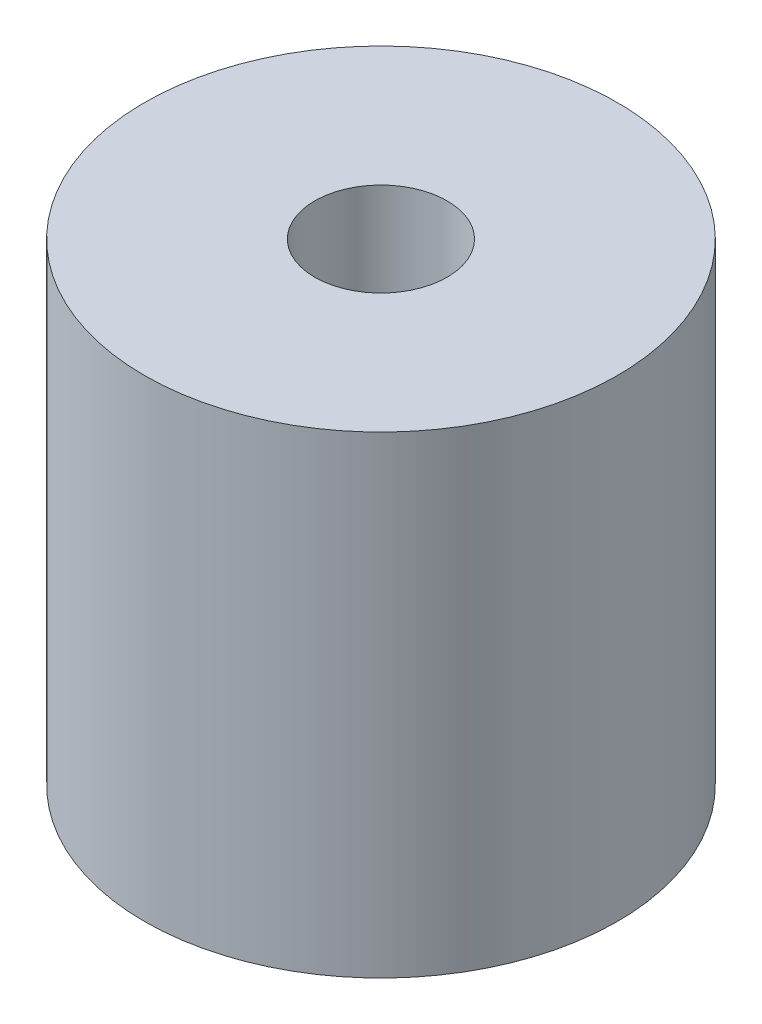
ISO-10303-21;
HEADER;
FILE_DESCRIPTION(('STEP AP214'),'2;1');
FILE_NAME('part.step','',(''),(''),'','','');
FILE_SCHEMA(('AUTOMOTIVE_DESIGN { 1 0 10303 214 1 1 1 1 }'));
ENDSEC;
DATA;
#1=APPLICATION_CONTEXT('core data for automotive mechanical design processes');
#2=APPLICATION_PROTOCOL_DEFINITION('international standard','automotive_design',2000,#1);
#3=PRODUCT_CONTEXT('',#1,'mechanical');
#4=PRODUCT('Part','Part','',(#3));
#5=PRODUCT_RELATED_PRODUCT_CATEGORY('part','',(#4));
#6=PRODUCT_DEFINITION_FORMATION('','',#4);
#7=PRODUCT_DEFINITION_CONTEXT('part definition',#1,'design');
#8=PRODUCT_DEFINITION('design','',#6,#7);
#9=PRODUCT_DEFINITION_SHAPE('','',#8);
#10=(LENGTH_UNIT() NAMED_UNIT(*) SI_UNIT(.MILLI.,.METRE.));
#11=(NAMED_UNIT(*) PLANE_ANGLE_UNIT() SI_UNIT($,.RADIAN.));
#12=(NAMED_UNIT(*) SI_UNIT($,.STERADIAN.) SOLID_ANGLE_UNIT());
#13=UNCERTAINTY_MEASURE_WITH_UNIT(LENGTH_MEASURE(1.E-05),#10,'distance_accuracy_value','');
#14=(GEOMETRIC_REPRESENTATION_CONTEXT(3) GLOBAL_UNCERTAINTY_ASSIGNED_CONTEXT((#13)) GLOBAL_UNIT_ASSIGNED_CONTEXT((#10,
#11,#12)) REPRESENTATION_CONTEXT('',''));
#15=CARTESIAN_POINT('',(0.,0.,0.));
#16=DIRECTION('',(0.,0.,1.));
#17=DIRECTION('',(1.,0.,0.));
#18=AXIS2_PLACEMENT_3D('',#15,#16,#17);
#19=CARTESIAN_POINT('',(0.,6.35,0.));
#20=DIRECTION('',(0.,1.,0.));
#21=DIRECTION('',(0.,0.,1.));
#22=AXIS2_PLACEMENT_3D('',#19,#20,#21);
#23=PLANE('',#22);
#24=CARTESIAN_POINT('',(0.,6.35,0.));
#25=DIRECTION('',(0.,1.,0.));
#26=DIRECTION('',(0.,0.,1.));
#27=AXIS2_PLACEMENT_3D('',#24,#25,#26);
#28=CIRCLE('',#27,3.175);
#29=CARTESIAN_POINT('',(0.,6.35,3.175));
#30=VERTEX_POINT('',#29);
#31=EDGE_CURVE('E10',#30,#30,#28,.T.);
#32=ORIENTED_EDGE('',*,*,#31,.T.);
#33=EDGE_LOOP('',(#32));
#34=FACE_BOUND('',#33,.T.);
#35=CARTESIAN_POINT('',(0.,6.35,0.));
#36=DIRECTION('',(0.,1.,0.));
#37=DIRECTION('',(0.,0.,1.));
#38=AXIS2_PLACEMENT_3D('',#35,#36,#37);
#39=CIRCLE('',#38,0.889);
#40=CARTESIAN_POINT('',(0.,6.35,0.889));
#41=VERTEX_POINT('',#40);
#42=EDGE_CURVE('E42',#41,#41,#39,.T.);
#43=ORIENTED_EDGE('',*,*,#42,.F.);
#44=EDGE_LOOP('',(#43));
#45=FACE_BOUND('',#44,.T.);
#46=ADVANCED_FACE('F31',(#34,#45),#23,.T.);
#47=CARTESIAN_POINT('',(0.,0.,0.));
#48=DIRECTION('',(0.,1.,0.));
#49=DIRECTION('',(0.,0.,1.));
#50=AXIS2_PLACEMENT_3D('',#47,#48,#49);
#51=PLANE('',#50);
#52=CARTESIAN_POINT('',(0.,0.,0.));
#53=DIRECTION('',(0.,1.,0.));
#54=DIRECTION('',(0.,0.,1.));
#55=AXIS2_PLACEMENT_3D('',#52,#53,#54);
#56=CIRCLE('',#55,3.175);
#57=CARTESIAN_POINT('',(0.,0.,3.175));
#58=VERTEX_POINT('',#57);
#59=EDGE_CURVE('E35',#58,#58,#56,.T.);
#60=ORIENTED_EDGE('',*,*,#59,.F.);
#61=EDGE_LOOP('',(#60));
#62=FACE_BOUND('',#61,.T.);
#63=CARTESIAN_POINT('',(0.,0.,0.));
#64=DIRECTION('',(0.,1.,0.));
#65=DIRECTION('',(0.,0.,1.));
#66=AXIS2_PLACEMENT_3D('',#63,#64,#65);
#67=CIRCLE('',#66,0.889);
#68=CARTESIAN_POINT('',(0.,0.,0.889));
#69=VERTEX_POINT('',#68);
#70=EDGE_CURVE('E44',#69,#69,#67,.T.);
#71=ORIENTED_EDGE('',*,*,#70,.T.);
#72=EDGE_LOOP('',(#71));
#73=FACE_BOUND('',#72,.T.);
#74=ADVANCED_FACE('F54',(#62,#73),#51,.F.);
#75=CARTESIAN_POINT('',(0.,6.35,0.));
#76=DIRECTION('',(0.,-1.,0.));
#77=DIRECTION('',(0.,0.,-1.));
#78=AXIS2_PLACEMENT_3D('',#75,#76,#77);
#79=CYLINDRICAL_SURFACE('',#78,3.175);
#80=ORIENTED_EDGE('',*,*,#31,.F.);
#81=EDGE_LOOP('',(#80));
#82=FACE_BOUND('',#81,.T.);
#83=ORIENTED_EDGE('',*,*,#59,.T.);
#84=EDGE_LOOP('',(#83));
#85=FACE_BOUND('',#84,.T.);
#86=ADVANCED_FACE('F33',(#82,#85),#79,.T.);
#87=CARTESIAN_POINT('',(0.,6.35,0.));
#88=DIRECTION('',(0.,-1.,0.));
#89=DIRECTION('',(0.,0.,-1.));
#90=AXIS2_PLACEMENT_3D('',#87,#88,#89);
#91=CYLINDRICAL_SURFACE('',#90,0.889);
#92=ORIENTED_EDGE('',*,*,#42,.T.);
#93=EDGE_LOOP('',(#92));
#94=FACE_BOUND('',#93,.T.);
#95=ORIENTED_EDGE('',*,*,#70,.F.);
#96=EDGE_LOOP('',(#95));
#97=FACE_BOUND('',#96,.T.);
#98=ADVANCED_FACE('F50',(#94,#97),#91,.F.);
#99=CLOSED_SHELL('',(#46,#74,#86,#98));
#100=MANIFOLD_SOLID_BREP('B2',#99);
#101=ADVANCED_BREP_SHAPE_REPRESENTATION('',(#18,#100),#14);
#102=SHAPE_DEFINITION_REPRESENTATION(#9,#101);
ENDSEC;
END-ISO-10303-21;
